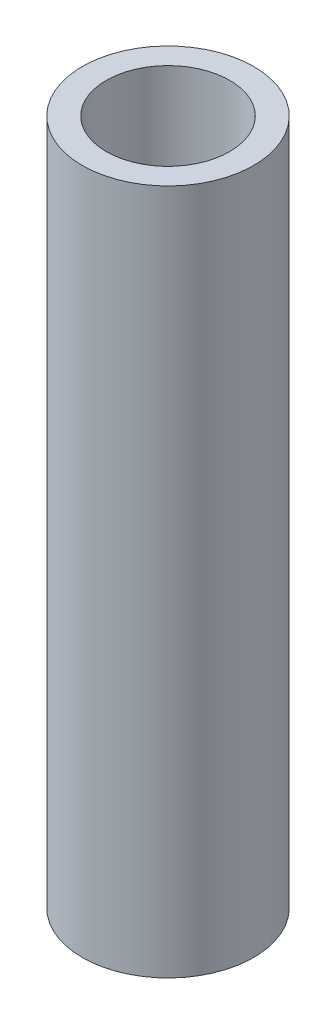
ISO-10303-21;
HEADER;
FILE_DESCRIPTION(('STEP AP214'),'2;1');
FILE_NAME('part.step','',(''),(''),'','','');
FILE_SCHEMA(('AUTOMOTIVE_DESIGN { 1 0 10303 214 1 1 1 1 }'));
ENDSEC;
DATA;
#1=APPLICATION_CONTEXT('core data for automotive mechanical design processes');
#2=APPLICATION_PROTOCOL_DEFINITION('international standard','automotive_design',2000,#1);
#3=PRODUCT_CONTEXT('',#1,'mechanical');
#4=PRODUCT('Part','Part','',(#3));
#5=PRODUCT_RELATED_PRODUCT_CATEGORY('part','',(#4));
#6=PRODUCT_DEFINITION_FORMATION('','',#4);
#7=PRODUCT_DEFINITION_CONTEXT('part definition',#1,'design');
#8=PRODUCT_DEFINITION('design','',#6,#7);
#9=PRODUCT_DEFINITION_SHAPE('','',#8);
#10=(LENGTH_UNIT() NAMED_UNIT(*) SI_UNIT(.MILLI.,.METRE.));
#11=(NAMED_UNIT(*) PLANE_ANGLE_UNIT() SI_UNIT($,.RADIAN.));
#12=(NAMED_UNIT(*) SI_UNIT($,.STERADIAN.) SOLID_ANGLE_UNIT());
#13=UNCERTAINTY_MEASURE_WITH_UNIT(LENGTH_MEASURE(1.E-05),#10,'distance_accuracy_value','');
#14=(GEOMETRIC_REPRESENTATION_CONTEXT(3) GLOBAL_UNCERTAINTY_ASSIGNED_CONTEXT((#13)) GLOBAL_UNIT_ASSIGNED_CONTEXT((#10,
#11,#12)) REPRESENTATION_CONTEXT('',''));
#15=CARTESIAN_POINT('',(0.,0.,0.));
#16=DIRECTION('',(0.,0.,1.));
#17=DIRECTION('',(1.,0.,0.));
#18=AXIS2_PLACEMENT_3D('',#15,#16,#17);
#19=CARTESIAN_POINT('',(0.,25.4,0.));
#20=DIRECTION('',(0.,1.,0.));
#21=DIRECTION('',(0.,0.,1.));
#22=AXIS2_PLACEMENT_3D('',#19,#20,#21);
#23=PLANE('',#22);
#24=CARTESIAN_POINT('',(0.,25.4,0.));
#25=DIRECTION('',(0.,1.,0.));
#26=DIRECTION('',(0.,0.,1.));
#27=AXIS2_PLACEMENT_3D('',#24,#25,#26);
#28=CIRCLE('',#27,3.175);
#29=CARTESIAN_POINT('',(0.,25.4,3.175));
#30=VERTEX_POINT('',#29);
#31=EDGE_CURVE('E10',#30,#30,#28,.T.);
#32=ORIENTED_EDGE('',*,*,#31,.T.);
#33=EDGE_LOOP('',(#32));
#34=FACE_BOUND('',#33,.T.);
#35=CARTESIAN_POINT('',(0.,25.4,0.));
#36=DIRECTION('',(0.,1.,0.));
#37=DIRECTION('',(0.,0.,1.));
#38=AXIS2_PLACEMENT_3D('',#35,#36,#37);
#39=CIRCLE('',#38,2.286);
#40=CARTESIAN_POINT('',(0.,25.4,2.286));
#41=VERTEX_POINT('',#40);
#42=EDGE_CURVE('E53',#41,#41,#39,.T.);
#43=ORIENTED_EDGE('',*,*,#42,.F.);
#44=EDGE_LOOP('',(#43));
#45=FACE_BOUND('',#44,.T.);
#46=ADVANCED_FACE('F40',(#34,#45),#23,.T.);
#47=CARTESIAN_POINT('',(0.,0.,0.));
#48=DIRECTION('',(0.,1.,0.));
#49=DIRECTION('',(0.,0.,1.));
#50=AXIS2_PLACEMENT_3D('',#47,#48,#49);
#51=PLANE('',#50);
#52=CARTESIAN_POINT('',(0.,0.,0.));
#53=DIRECTION('',(0.,1.,0.));
#54=DIRECTION('',(0.,0.,1.));
#55=AXIS2_PLACEMENT_3D('',#52,#53,#54);
#56=CIRCLE('',#55,3.175);
#57=CARTESIAN_POINT('',(0.,0.,3.175));
#58=VERTEX_POINT('',#57);
#59=EDGE_CURVE('E44',#58,#58,#56,.T.);
#60=ORIENTED_EDGE('',*,*,#59,.F.);
#61=EDGE_LOOP('',(#60));
#62=FACE_BOUND('',#61,.T.);
#63=CARTESIAN_POINT('',(0.,0.,0.));
#64=DIRECTION('',(0.,1.,0.));
#65=DIRECTION('',(0.,0.,1.));
#66=AXIS2_PLACEMENT_3D('',#63,#64,#65);
#67=CIRCLE('',#66,2.286);
#68=CARTESIAN_POINT('',(0.,0.,2.286));
#69=VERTEX_POINT('',#68);
#70=EDGE_CURVE('E55',#69,#69,#67,.T.);
#71=ORIENTED_EDGE('',*,*,#70,.T.);
#72=EDGE_LOOP('',(#71));
#73=FACE_BOUND('',#72,.T.);
#74=ADVANCED_FACE('F67',(#62,#73),#51,.F.);
#75=CARTESIAN_POINT('',(0.,25.4,0.));
#76=DIRECTION('',(0.,-1.,0.));
#77=DIRECTION('',(0.,0.,-1.));
#78=AXIS2_PLACEMENT_3D('',#75,#76,#77);
#79=CYLINDRICAL_SURFACE('',#78,3.175);
#80=ORIENTED_EDGE('',*,*,#31,.F.);
#81=EDGE_LOOP('',(#80));
#82=FACE_BOUND('',#81,.T.);
#83=ORIENTED_EDGE('',*,*,#59,.T.);
#84=EDGE_LOOP('',(#83));
#85=FACE_BOUND('',#84,.T.);
#86=ADVANCED_FACE('F42',(#82,#85),#79,.T.);
#87=CARTESIAN_POINT('',(0.,25.4,0.));
#88=DIRECTION('',(0.,-1.,0.));
#89=DIRECTION('',(0.,0.,-1.));
#90=AXIS2_PLACEMENT_3D('',#87,#88,#89);
#91=CYLINDRICAL_SURFACE('',#90,2.286);
#92=ORIENTED_EDGE('',*,*,#42,.T.);
#93=EDGE_LOOP('',(#92));
#94=FACE_BOUND('',#93,.T.);
#95=ORIENTED_EDGE('',*,*,#70,.F.);
#96=EDGE_LOOP('',(#95));
#97=FACE_BOUND('',#96,.T.);
#98=ADVANCED_FACE('F63',(#94,#97),#91,.F.);
#99=CLOSED_SHELL('',(#46,#74,#86,#98));
#100=MANIFOLD_SOLID_BREP('B2',#99);
#101=ADVANCED_BREP_SHAPE_REPRESENTATION('',(#18,#100),#14);
#102=SHAPE_DEFINITION_REPRESENTATION(#9,#101);
ENDSEC;
END-ISO-10303-21;
